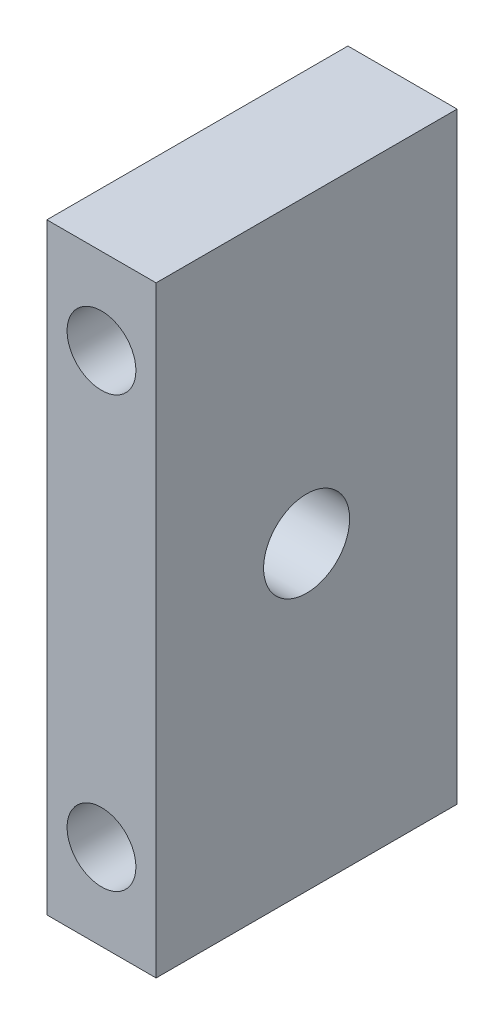
ISO-10303-21;
HEADER;
FILE_DESCRIPTION(('STEP AP214'),'2;1');
FILE_NAME('part.step','',(''),(''),'','','');
FILE_SCHEMA(('AUTOMOTIVE_DESIGN { 1 0 10303 214 1 1 1 1 }'));
ENDSEC;
DATA;
#1=APPLICATION_CONTEXT('core data for automotive mechanical design processes');
#2=APPLICATION_PROTOCOL_DEFINITION('international standard','automotive_design',2000,#1);
#3=PRODUCT_CONTEXT('',#1,'mechanical');
#4=PRODUCT('Part','Part','',(#3));
#5=PRODUCT_RELATED_PRODUCT_CATEGORY('part','',(#4));
#6=PRODUCT_DEFINITION_FORMATION('','',#4);
#7=PRODUCT_DEFINITION_CONTEXT('part definition',#1,'design');
#8=PRODUCT_DEFINITION('design','',#6,#7);
#9=PRODUCT_DEFINITION_SHAPE('','',#8);
#10=(LENGTH_UNIT() NAMED_UNIT(*) SI_UNIT(.MILLI.,.METRE.));
#11=(NAMED_UNIT(*) PLANE_ANGLE_UNIT() SI_UNIT($,.RADIAN.));
#12=(NAMED_UNIT(*) SI_UNIT($,.STERADIAN.) SOLID_ANGLE_UNIT());
#13=UNCERTAINTY_MEASURE_WITH_UNIT(LENGTH_MEASURE(1.E-05),#10,'distance_accuracy_value','');
#14=(GEOMETRIC_REPRESENTATION_CONTEXT(3) GLOBAL_UNCERTAINTY_ASSIGNED_CONTEXT((#13)) GLOBAL_UNIT_ASSIGNED_CONTEXT((#10,
#11,#12)) REPRESENTATION_CONTEXT('',''));
#15=CARTESIAN_POINT('',(0.,0.,0.));
#16=DIRECTION('',(0.,0.,1.));
#17=DIRECTION('',(1.,0.,0.));
#18=AXIS2_PLACEMENT_3D('',#15,#16,#17);
#19=CARTESIAN_POINT('',(6.35,0.,0.));
#20=DIRECTION('',(-1.,0.,0.));
#21=DIRECTION('',(0.,0.,1.));
#22=AXIS2_PLACEMENT_3D('',#19,#20,#21);
#23=PLANE('',#22);
#24=DIRECTION('',(0.,1.,0.));
#25=VECTOR('',#24,1.);
#26=CARTESIAN_POINT('',(6.35,-35.,-17.5));
#27=LINE('',#26,#25);
#28=CARTESIAN_POINT('',(6.35,-35.,-17.5));
#29=VERTEX_POINT('',#28);
#30=CARTESIAN_POINT('',(6.35,35.,-17.5));
#31=VERTEX_POINT('',#30);
#32=EDGE_CURVE('E85',#29,#31,#27,.T.);
#33=ORIENTED_EDGE('',*,*,#32,.T.);
#34=DIRECTION('',(0.,0.,1.));
#35=VECTOR('',#34,1.);
#36=CARTESIAN_POINT('',(6.35,35.,17.5));
#37=LINE('',#36,#35);
#38=CARTESIAN_POINT('',(6.35,35.,17.5));
#39=VERTEX_POINT('',#38);
#40=EDGE_CURVE('E80',#31,#39,#37,.T.);
#41=ORIENTED_EDGE('',*,*,#40,.T.);
#42=DIRECTION('',(0.,-1.,0.));
#43=VECTOR('',#42,1.);
#44=CARTESIAN_POINT('',(6.35,-35.,17.5));
#45=LINE('',#44,#43);
#46=CARTESIAN_POINT('',(6.35,-35.,17.5));
#47=VERTEX_POINT('',#46);
#48=EDGE_CURVE('E83',#39,#47,#45,.T.);
#49=ORIENTED_EDGE('',*,*,#48,.T.);
#50=DIRECTION('',(0.,0.,-1.));
#51=VECTOR('',#50,1.);
#52=CARTESIAN_POINT('',(6.35,-35.,17.5));
#53=LINE('',#52,#51);
#54=EDGE_CURVE('E50',#47,#29,#53,.T.);
#55=ORIENTED_EDGE('',*,*,#54,.T.);
#56=EDGE_LOOP('',(#33,#41,#49,#55));
#57=FACE_BOUND('',#56,.T.);
#58=CARTESIAN_POINT('',(6.35,0.,0.));
#59=DIRECTION('',(1.,0.,0.));
#60=DIRECTION('',(0.,0.,-1.));
#61=AXIS2_PLACEMENT_3D('',#58,#59,#60);
#62=CIRCLE('',#61,5.);
#63=CARTESIAN_POINT('',(6.35,0.,-5.));
#64=VERTEX_POINT('',#63);
#65=EDGE_CURVE('E100',#64,#64,#62,.T.);
#66=ORIENTED_EDGE('',*,*,#65,.F.);
#67=EDGE_LOOP('',(#66));
#68=FACE_BOUND('',#67,.T.);
#69=ADVANCED_FACE('F33',(#57,#68),#23,.F.);
#70=CARTESIAN_POINT('',(-6.35,0.,0.));
#71=DIRECTION('',(-1.,0.,0.));
#72=DIRECTION('',(0.,0.,1.));
#73=AXIS2_PLACEMENT_3D('',#70,#71,#72);
#74=PLANE('',#73);
#75=DIRECTION('',(0.,1.,0.));
#76=VECTOR('',#75,1.);
#77=CARTESIAN_POINT('',(-6.35,-35.,-17.5));
#78=LINE('',#77,#76);
#79=CARTESIAN_POINT('',(-6.35,-35.,-17.5));
#80=VERTEX_POINT('',#79);
#81=CARTESIAN_POINT('',(-6.35,35.,-17.5));
#82=VERTEX_POINT('',#81);
#83=EDGE_CURVE('E97',#80,#82,#78,.T.);
#84=ORIENTED_EDGE('',*,*,#83,.F.);
#85=DIRECTION('',(0.,0.,-1.));
#86=VECTOR('',#85,1.);
#87=CARTESIAN_POINT('',(-6.35,-35.,17.5));
#88=LINE('',#87,#86);
#89=CARTESIAN_POINT('',(-6.35,-35.,17.5));
#90=VERTEX_POINT('',#89);
#91=EDGE_CURVE('E73',#90,#80,#88,.T.);
#92=ORIENTED_EDGE('',*,*,#91,.F.);
#93=DIRECTION('',(0.,-1.,0.));
#94=VECTOR('',#93,1.);
#95=CARTESIAN_POINT('',(-6.35,-35.,17.5));
#96=LINE('',#95,#94);
#97=CARTESIAN_POINT('',(-6.35,35.,17.5));
#98=VERTEX_POINT('',#97);
#99=EDGE_CURVE('E67',#98,#90,#96,.T.);
#100=ORIENTED_EDGE('',*,*,#99,.F.);
#101=DIRECTION('',(0.,0.,1.));
#102=VECTOR('',#101,1.);
#103=CARTESIAN_POINT('',(-6.35,35.,17.5));
#104=LINE('',#103,#102);
#105=EDGE_CURVE('E89',#82,#98,#104,.T.);
#106=ORIENTED_EDGE('',*,*,#105,.F.);
#107=EDGE_LOOP('',(#84,#92,#100,#106));
#108=FACE_BOUND('',#107,.T.);
#109=CARTESIAN_POINT('',(-6.35,0.,0.));
#110=DIRECTION('',(1.,0.,0.));
#111=DIRECTION('',(0.,0.,-1.));
#112=AXIS2_PLACEMENT_3D('',#109,#110,#111);
#113=CIRCLE('',#112,5.);
#114=CARTESIAN_POINT('',(-6.35,0.,-5.));
#115=VERTEX_POINT('',#114);
#116=EDGE_CURVE('E112',#115,#115,#113,.T.);
#117=ORIENTED_EDGE('',*,*,#116,.T.);
#118=EDGE_LOOP('',(#117));
#119=FACE_BOUND('',#118,.T.);
#120=ADVANCED_FACE('F108',(#108,#119),#74,.T.);
#121=CARTESIAN_POINT('',(6.35,-35.,-17.5));
#122=DIRECTION('',(0.,0.,1.));
#123=DIRECTION('',(1.,0.,0.));
#124=AXIS2_PLACEMENT_3D('',#121,#122,#123);
#125=PLANE('',#124);
#126=CARTESIAN_POINT('',(0.,25.,-17.5));
#127=DIRECTION('',(0.,0.,1.));
#128=DIRECTION('',(1.,0.,0.));
#129=AXIS2_PLACEMENT_3D('',#126,#127,#128);
#130=CIRCLE('',#129,3.99999999999999);
#131=CARTESIAN_POINT('',(4.,25.,-17.5));
#132=VERTEX_POINT('',#131);
#133=EDGE_CURVE('E123',#132,#132,#130,.T.);
#134=ORIENTED_EDGE('',*,*,#133,.T.);
#135=EDGE_LOOP('',(#134));
#136=FACE_BOUND('',#135,.T.);
#137=CARTESIAN_POINT('',(0.,-25.,-17.5));
#138=DIRECTION('',(0.,0.,1.));
#139=DIRECTION('',(1.,0.,0.));
#140=AXIS2_PLACEMENT_3D('',#137,#138,#139);
#141=CIRCLE('',#140,3.99999999999999);
#142=CARTESIAN_POINT('',(4.,-25.,-17.5));
#143=VERTEX_POINT('',#142);
#144=EDGE_CURVE('E115',#143,#143,#141,.T.);
#145=ORIENTED_EDGE('',*,*,#144,.T.);
#146=EDGE_LOOP('',(#145));
#147=FACE_BOUND('',#146,.T.);
#148=ORIENTED_EDGE('',*,*,#83,.T.);
#149=DIRECTION('',(-1.,0.,0.));
#150=VECTOR('',#149,1.);
#151=CARTESIAN_POINT('',(6.35,35.,-17.5));
#152=LINE('',#151,#150);
#153=EDGE_CURVE('E11',#31,#82,#152,.T.);
#154=ORIENTED_EDGE('',*,*,#153,.F.);
#155=ORIENTED_EDGE('',*,*,#32,.F.);
#156=DIRECTION('',(-1.,0.,0.));
#157=VECTOR('',#156,1.);
#158=CARTESIAN_POINT('',(6.35,-35.,-17.5));
#159=LINE('',#158,#157);
#160=EDGE_CURVE('E93',#29,#80,#159,.T.);
#161=ORIENTED_EDGE('',*,*,#160,.T.);
#162=EDGE_LOOP('',(#148,#154,#155,#161));
#163=FACE_BOUND('',#162,.T.);
#164=ADVANCED_FACE('F35',(#136,#147,#163),#125,.F.);
#165=CARTESIAN_POINT('',(6.35,35.,17.5));
#166=DIRECTION('',(0.,-1.,0.));
#167=DIRECTION('',(0.,0.,-1.));
#168=AXIS2_PLACEMENT_3D('',#165,#166,#167);
#169=PLANE('',#168);
#170=ORIENTED_EDGE('',*,*,#105,.T.);
#171=DIRECTION('',(-1.,0.,0.));
#172=VECTOR('',#171,1.);
#173=CARTESIAN_POINT('',(6.35,35.,17.5));
#174=LINE('',#173,#172);
#175=EDGE_CURVE('E42',#39,#98,#174,.T.);
#176=ORIENTED_EDGE('',*,*,#175,.F.);
#177=ORIENTED_EDGE('',*,*,#40,.F.);
#178=ORIENTED_EDGE('',*,*,#153,.T.);
#179=EDGE_LOOP('',(#170,#176,#177,#178));
#180=FACE_BOUND('',#179,.T.);
#181=ADVANCED_FACE('F88',(#180),#169,.F.);
#182=CARTESIAN_POINT('',(6.35,-35.,17.5));
#183=DIRECTION('',(0.,0.,-1.));
#184=DIRECTION('',(-1.,0.,0.));
#185=AXIS2_PLACEMENT_3D('',#182,#183,#184);
#186=PLANE('',#185);
#187=CARTESIAN_POINT('',(0.,25.,17.5));
#188=DIRECTION('',(0.,0.,1.));
#189=DIRECTION('',(1.,0.,0.));
#190=AXIS2_PLACEMENT_3D('',#187,#188,#189);
#191=CIRCLE('',#190,4.);
#192=CARTESIAN_POINT('',(4.,25.,17.5));
#193=VERTEX_POINT('',#192);
#194=EDGE_CURVE('E126',#193,#193,#191,.T.);
#195=ORIENTED_EDGE('',*,*,#194,.F.);
#196=EDGE_LOOP('',(#195));
#197=FACE_BOUND('',#196,.T.);
#198=CARTESIAN_POINT('',(0.,-25.,17.5));
#199=DIRECTION('',(0.,0.,1.));
#200=DIRECTION('',(1.,0.,0.));
#201=AXIS2_PLACEMENT_3D('',#198,#199,#200);
#202=CIRCLE('',#201,4.);
#203=CARTESIAN_POINT('',(4.,-25.,17.5));
#204=VERTEX_POINT('',#203);
#205=EDGE_CURVE('E120',#204,#204,#202,.T.);
#206=ORIENTED_EDGE('',*,*,#205,.F.);
#207=EDGE_LOOP('',(#206));
#208=FACE_BOUND('',#207,.T.);
#209=ORIENTED_EDGE('',*,*,#99,.T.);
#210=DIRECTION('',(-1.,0.,0.));
#211=VECTOR('',#210,1.);
#212=CARTESIAN_POINT('',(6.35,-35.,17.5));
#213=LINE('',#212,#211);
#214=EDGE_CURVE('E90',#47,#90,#213,.T.);
#215=ORIENTED_EDGE('',*,*,#214,.F.);
#216=ORIENTED_EDGE('',*,*,#48,.F.);
#217=ORIENTED_EDGE('',*,*,#175,.T.);
#218=EDGE_LOOP('',(#209,#215,#216,#217));
#219=FACE_BOUND('',#218,.T.);
#220=ADVANCED_FACE('F91',(#197,#208,#219),#186,.F.);
#221=CARTESIAN_POINT('',(6.35,-35.,17.5));
#222=DIRECTION('',(0.,1.,0.));
#223=DIRECTION('',(0.,0.,1.));
#224=AXIS2_PLACEMENT_3D('',#221,#222,#223);
#225=PLANE('',#224);
#226=ORIENTED_EDGE('',*,*,#91,.T.);
#227=ORIENTED_EDGE('',*,*,#160,.F.);
#228=ORIENTED_EDGE('',*,*,#54,.F.);
#229=ORIENTED_EDGE('',*,*,#214,.T.);
#230=EDGE_LOOP('',(#226,#227,#228,#229));
#231=FACE_BOUND('',#230,.T.);
#232=ADVANCED_FACE('F105',(#231),#225,.F.);
#233=CARTESIAN_POINT('',(6.35,0.,0.));
#234=DIRECTION('',(-1.,0.,0.));
#235=DIRECTION('',(0.,0.,1.));
#236=AXIS2_PLACEMENT_3D('',#233,#234,#235);
#237=CYLINDRICAL_SURFACE('',#236,5.);
#238=ORIENTED_EDGE('',*,*,#65,.T.);
#239=EDGE_LOOP('',(#238));
#240=FACE_BOUND('',#239,.T.);
#241=ORIENTED_EDGE('',*,*,#116,.F.);
#242=EDGE_LOOP('',(#241));
#243=FACE_BOUND('',#242,.T.);
#244=ADVANCED_FACE('F139',(#240,#243),#237,.F.);
#245=CARTESIAN_POINT('',(0.,-25.,17.5));
#246=DIRECTION('',(0.,0.,1.));
#247=DIRECTION('',(1.,0.,0.));
#248=AXIS2_PLACEMENT_3D('',#245,#246,#247);
#249=CYLINDRICAL_SURFACE('',#248,3.99999999999999);
#250=ORIENTED_EDGE('',*,*,#144,.F.);
#251=EDGE_LOOP('',(#250));
#252=FACE_BOUND('',#251,.T.);
#253=ORIENTED_EDGE('',*,*,#205,.T.);
#254=EDGE_LOOP('',(#253));
#255=FACE_BOUND('',#254,.T.);
#256=ADVANCED_FACE('F137',(#252,#255),#249,.F.);
#257=CARTESIAN_POINT('',(0.,25.,17.5));
#258=DIRECTION('',(0.,0.,1.));
#259=DIRECTION('',(1.,0.,0.));
#260=AXIS2_PLACEMENT_3D('',#257,#258,#259);
#261=CYLINDRICAL_SURFACE('',#260,3.99999999999999);
#262=ORIENTED_EDGE('',*,*,#133,.F.);
#263=EDGE_LOOP('',(#262));
#264=FACE_BOUND('',#263,.T.);
#265=ORIENTED_EDGE('',*,*,#194,.T.);
#266=EDGE_LOOP('',(#265));
#267=FACE_BOUND('',#266,.T.);
#268=ADVANCED_FACE('F130',(#264,#267),#261,.F.);
#269=CLOSED_SHELL('',(#69,#120,#164,#181,#220,#232,#244,#256,#268));
#270=MANIFOLD_SOLID_BREP('B2',#269);
#271=ADVANCED_BREP_SHAPE_REPRESENTATION('',(#18,#270),#14);
#272=SHAPE_DEFINITION_REPRESENTATION(#9,#271);
ENDSEC;
END-ISO-10303-21;
